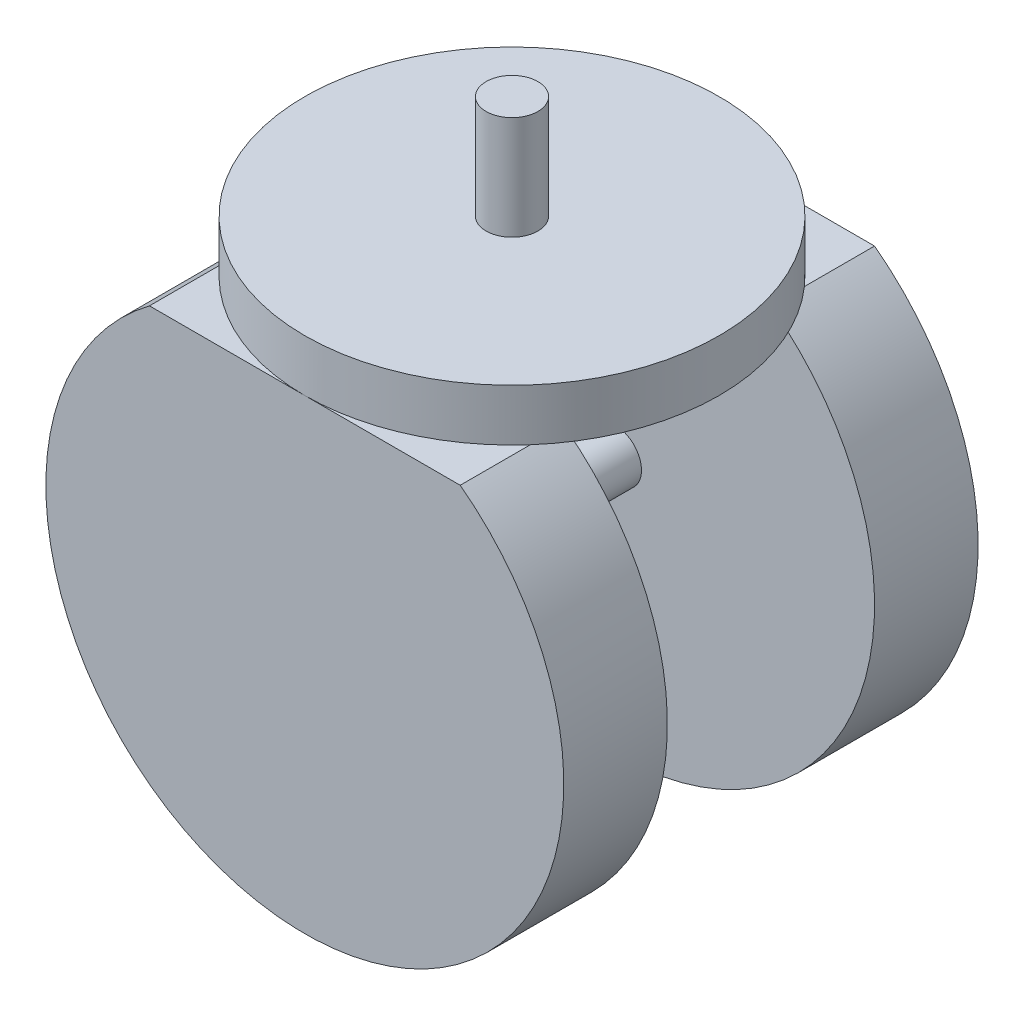
ISO-10303-21;
HEADER;
FILE_DESCRIPTION(('STEP AP214'),'2;1');
FILE_NAME('part.step','',(''),(''),'','','');
FILE_SCHEMA(('AUTOMOTIVE_DESIGN { 1 0 10303 214 1 1 1 1 }'));
ENDSEC;
DATA;
#1=APPLICATION_CONTEXT('core data for automotive mechanical design processes');
#2=APPLICATION_PROTOCOL_DEFINITION('international standard','automotive_design',2000,#1);
#3=PRODUCT_CONTEXT('',#1,'mechanical');
#4=PRODUCT('Part','Part','',(#3));
#5=PRODUCT_RELATED_PRODUCT_CATEGORY('part','',(#4));
#6=PRODUCT_DEFINITION_FORMATION('','',#4);
#7=PRODUCT_DEFINITION_CONTEXT('part definition',#1,'design');
#8=PRODUCT_DEFINITION('design','',#6,#7);
#9=PRODUCT_DEFINITION_SHAPE('','',#8);
#10=(LENGTH_UNIT() NAMED_UNIT(*) SI_UNIT(.MILLI.,.METRE.));
#11=(NAMED_UNIT(*) PLANE_ANGLE_UNIT() SI_UNIT($,.RADIAN.));
#12=(NAMED_UNIT(*) SI_UNIT($,.STERADIAN.) SOLID_ANGLE_UNIT());
#13=UNCERTAINTY_MEASURE_WITH_UNIT(LENGTH_MEASURE(1.E-05),#10,'distance_accuracy_value','');
#14=(GEOMETRIC_REPRESENTATION_CONTEXT(3) GLOBAL_UNCERTAINTY_ASSIGNED_CONTEXT((#13)) GLOBAL_UNIT_ASSIGNED_CONTEXT((#10,
#11,#12)) REPRESENTATION_CONTEXT('',''));
#15=CARTESIAN_POINT('',(0.,0.,0.));
#16=DIRECTION('',(0.,0.,1.));
#17=DIRECTION('',(1.,0.,0.));
#18=AXIS2_PLACEMENT_3D('',#15,#16,#17);
#19=CARTESIAN_POINT('',(0.,50.8,0.));
#20=DIRECTION('',(0.,-1.,0.));
#21=DIRECTION('',(0.,0.,-1.));
#22=AXIS2_PLACEMENT_3D('',#19,#20,#21);
#23=PLANE('',#22);
#24=CARTESIAN_POINT('',(0.,50.8,-25.4));
#25=DIRECTION('',(0.,1.,0.));
#26=DIRECTION('',(0.,0.,1.));
#27=AXIS2_PLACEMENT_3D('',#24,#25,#26);
#28=CIRCLE('',#27,50.8);
#29=CARTESIAN_POINT('',(0.,50.8,-76.2));
#30=VERTEX_POINT('',#29);
#31=CARTESIAN_POINT('',(-38.1,50.8,-59.0010416505203));
#32=VERTEX_POINT('',#31);
#33=EDGE_CURVE('E132',#30,#32,#28,.T.);
#34=ORIENTED_EDGE('',*,*,#33,.F.);
#35=DIRECTION('',(-1.,0.,0.));
#36=VECTOR('',#35,1.);
#37=CARTESIAN_POINT('',(-63.5,50.8,-76.2));
#38=LINE('',#37,#36);
#39=CARTESIAN_POINT('',(-38.1,50.8,-76.2));
#40=VERTEX_POINT('',#39);
#41=EDGE_CURVE('E129',#30,#40,#38,.T.);
#42=ORIENTED_EDGE('',*,*,#41,.T.);
#43=DIRECTION('',(0.,0.,1.));
#44=VECTOR('',#43,1.);
#45=CARTESIAN_POINT('',(-38.1,50.8,-76.2));
#46=LINE('',#45,#44);
#47=EDGE_CURVE('E59',#32,#40,#46,.F.);
#48=ORIENTED_EDGE('',*,*,#47,.F.);
#49=EDGE_LOOP('',(#34,#42,#48));
#50=FACE_BOUND('',#49,.T.);
#51=ADVANCED_FACE('F36',(#50),#23,.F.);
#52=CARTESIAN_POINT('',(0.,50.8,-25.4));
#53=DIRECTION('',(0.,-1.,0.));
#54=DIRECTION('',(0.,0.,-1.));
#55=AXIS2_PLACEMENT_3D('',#52,#53,#54);
#56=CIRCLE('',#55,50.8);
#57=CARTESIAN_POINT('',(-38.1,50.8,8.2010416505203));
#58=VERTEX_POINT('',#57);
#59=CARTESIAN_POINT('',(0.,50.8,25.4));
#60=VERTEX_POINT('',#59);
#61=EDGE_CURVE('E11',#58,#60,#56,.F.);
#62=ORIENTED_EDGE('',*,*,#61,.F.);
#63=DIRECTION('',(0.,0.,-1.));
#64=VECTOR('',#63,1.);
#65=CARTESIAN_POINT('',(-38.1,50.8,25.4));
#66=LINE('',#65,#64);
#67=CARTESIAN_POINT('',(-38.1,50.8,25.4));
#68=VERTEX_POINT('',#67);
#69=EDGE_CURVE('E215',#68,#58,#66,.T.);
#70=ORIENTED_EDGE('',*,*,#69,.F.);
#71=DIRECTION('',(1.,0.,0.));
#72=VECTOR('',#71,1.);
#73=CARTESIAN_POINT('',(-63.5,50.8,25.4));
#74=LINE('',#73,#72);
#75=EDGE_CURVE('E230',#68,#60,#74,.T.);
#76=ORIENTED_EDGE('',*,*,#75,.T.);
#77=EDGE_LOOP('',(#62,#70,#76));
#78=FACE_BOUND('',#77,.T.);
#79=ADVANCED_FACE('F161',(#78),#23,.F.);
#80=CARTESIAN_POINT('',(0.,0.,25.4));
#81=DIRECTION('',(0.,0.,-1.));
#82=DIRECTION('',(-1.,0.,0.));
#83=AXIS2_PLACEMENT_3D('',#80,#81,#82);
#84=CYLINDRICAL_SURFACE('',#83,63.5);
#85=CARTESIAN_POINT('',(0.,0.,25.4));
#86=DIRECTION('',(0.,0.,1.));
#87=DIRECTION('',(1.,0.,0.));
#88=AXIS2_PLACEMENT_3D('',#85,#86,#87);
#89=CIRCLE('',#88,63.5);
#90=CARTESIAN_POINT('',(38.1,50.8,25.4));
#91=VERTEX_POINT('',#90);
#92=EDGE_CURVE('E206',#68,#91,#89,.T.);
#93=ORIENTED_EDGE('',*,*,#92,.F.);
#94=ORIENTED_EDGE('',*,*,#69,.T.);
#95=CARTESIAN_POINT('',(-38.1,50.8,0.));
#96=VERTEX_POINT('',#95);
#97=EDGE_CURVE('E106',#58,#96,#66,.T.);
#98=ORIENTED_EDGE('',*,*,#97,.T.);
#99=CARTESIAN_POINT('',(0.,0.,0.));
#100=DIRECTION('',(0.,0.,1.));
#101=DIRECTION('',(1.,0.,0.));
#102=AXIS2_PLACEMENT_3D('',#99,#100,#101);
#103=CIRCLE('',#102,63.5);
#104=CARTESIAN_POINT('',(38.1,50.8,0.));
#105=VERTEX_POINT('',#104);
#106=EDGE_CURVE('E102',#96,#105,#103,.T.);
#107=ORIENTED_EDGE('',*,*,#106,.T.);
#108=DIRECTION('',(0.,0.,-1.));
#109=VECTOR('',#108,1.);
#110=CARTESIAN_POINT('',(38.1,50.8,25.4));
#111=LINE('',#110,#109);
#112=CARTESIAN_POINT('',(38.1,50.8,8.2010416505203));
#113=VERTEX_POINT('',#112);
#114=EDGE_CURVE('E96',#105,#113,#111,.F.);
#115=ORIENTED_EDGE('',*,*,#114,.T.);
#116=EDGE_CURVE('E99',#113,#91,#111,.F.);
#117=ORIENTED_EDGE('',*,*,#116,.T.);
#118=EDGE_LOOP('',(#93,#94,#98,#107,#115,#117));
#119=FACE_BOUND('',#118,.T.);
#120=ADVANCED_FACE('F38',(#119),#84,.T.);
#121=CARTESIAN_POINT('',(0.,0.,25.4));
#122=DIRECTION('',(0.,0.,1.));
#123=DIRECTION('',(1.,0.,0.));
#124=AXIS2_PLACEMENT_3D('',#121,#122,#123);
#125=PLANE('',#124);
#126=ORIENTED_EDGE('',*,*,#75,.F.);
#127=ORIENTED_EDGE('',*,*,#92,.T.);
#128=EDGE_CURVE('E113',#60,#91,#74,.T.);
#129=ORIENTED_EDGE('',*,*,#128,.F.);
#130=EDGE_LOOP('',(#126,#127,#129));
#131=FACE_BOUND('',#130,.T.);
#132=ADVANCED_FACE('F195',(#131),#125,.T.);
#133=CARTESIAN_POINT('',(0.,0.,0.));
#134=DIRECTION('',(0.,0.,1.));
#135=DIRECTION('',(1.,0.,0.));
#136=AXIS2_PLACEMENT_3D('',#133,#134,#135);
#137=PLANE('',#136);
#138=CARTESIAN_POINT('',(0.,0.,0.));
#139=DIRECTION('',(0.,0.,1.));
#140=DIRECTION('',(1.,0.,0.));
#141=AXIS2_PLACEMENT_3D('',#138,#139,#140);
#142=CIRCLE('',#141,6.35);
#143=CARTESIAN_POINT('',(6.35,0.,0.));
#144=VERTEX_POINT('',#143);
#145=EDGE_CURVE('E205',#144,#144,#142,.F.);
#146=ORIENTED_EDGE('',*,*,#145,.F.);
#147=EDGE_LOOP('',(#146));
#148=FACE_BOUND('',#147,.T.);
#149=ORIENTED_EDGE('',*,*,#106,.F.);
#150=DIRECTION('',(1.,0.,0.));
#151=VECTOR('',#150,1.);
#152=CARTESIAN_POINT('',(0.,50.8,0.));
#153=LINE('',#152,#151);
#154=EDGE_CURVE('E115',#96,#105,#153,.T.);
#155=ORIENTED_EDGE('',*,*,#154,.T.);
#156=EDGE_LOOP('',(#149,#155));
#157=FACE_BOUND('',#156,.T.);
#158=ADVANCED_FACE('F193',(#148,#157),#137,.F.);
#159=CARTESIAN_POINT('',(0.,0.,-50.8));
#160=DIRECTION('',(0.,0.,1.));
#161=DIRECTION('',(1.,0.,0.));
#162=AXIS2_PLACEMENT_3D('',#159,#160,#161);
#163=CYLINDRICAL_SURFACE('',#162,6.35);
#164=CARTESIAN_POINT('',(0.,0.,-50.8));
#165=DIRECTION('',(0.,0.,-1.));
#166=DIRECTION('',(-1.,0.,0.));
#167=AXIS2_PLACEMENT_3D('',#164,#165,#166);
#168=CIRCLE('',#167,6.35);
#169=CARTESIAN_POINT('',(-6.35,0.,-50.8));
#170=VERTEX_POINT('',#169);
#171=EDGE_CURVE('E207',#170,#170,#168,.T.);
#172=ORIENTED_EDGE('',*,*,#171,.F.);
#173=EDGE_LOOP('',(#172));
#174=FACE_BOUND('',#173,.T.);
#175=ORIENTED_EDGE('',*,*,#145,.T.);
#176=EDGE_LOOP('',(#175));
#177=FACE_BOUND('',#176,.T.);
#178=ADVANCED_FACE('F189',(#174,#177),#163,.T.);
#179=CARTESIAN_POINT('',(0.,0.,-76.2));
#180=DIRECTION('',(0.,0.,1.));
#181=DIRECTION('',(1.,0.,0.));
#182=AXIS2_PLACEMENT_3D('',#179,#180,#181);
#183=CYLINDRICAL_SURFACE('',#182,63.5);
#184=CARTESIAN_POINT('',(0.,0.,-76.2));
#185=DIRECTION('',(0.,0.,-1.));
#186=DIRECTION('',(-1.,0.,0.));
#187=AXIS2_PLACEMENT_3D('',#184,#185,#186);
#188=CIRCLE('',#187,63.5);
#189=CARTESIAN_POINT('',(38.1,50.8,-76.2));
#190=VERTEX_POINT('',#189);
#191=EDGE_CURVE('E219',#190,#40,#188,.T.);
#192=ORIENTED_EDGE('',*,*,#191,.F.);
#193=DIRECTION('',(0.,0.,1.));
#194=VECTOR('',#193,1.);
#195=CARTESIAN_POINT('',(38.1,50.8,-76.2));
#196=LINE('',#195,#194);
#197=CARTESIAN_POINT('',(38.1,50.8,-59.0010416505203));
#198=VERTEX_POINT('',#197);
#199=EDGE_CURVE('E210',#190,#198,#196,.T.);
#200=ORIENTED_EDGE('',*,*,#199,.T.);
#201=CARTESIAN_POINT('',(38.1,50.8,-50.8));
#202=VERTEX_POINT('',#201);
#203=EDGE_CURVE('E121',#198,#202,#196,.T.);
#204=ORIENTED_EDGE('',*,*,#203,.T.);
#205=CARTESIAN_POINT('',(0.,0.,-50.8));
#206=DIRECTION('',(0.,0.,-1.));
#207=DIRECTION('',(-1.,0.,0.));
#208=AXIS2_PLACEMENT_3D('',#205,#206,#207);
#209=CIRCLE('',#208,63.5);
#210=CARTESIAN_POINT('',(-38.1,50.8,-50.8));
#211=VERTEX_POINT('',#210);
#212=EDGE_CURVE('E218',#202,#211,#209,.T.);
#213=ORIENTED_EDGE('',*,*,#212,.T.);
#214=EDGE_CURVE('E229',#211,#32,#46,.F.);
#215=ORIENTED_EDGE('',*,*,#214,.T.);
#216=ORIENTED_EDGE('',*,*,#47,.T.);
#217=EDGE_LOOP('',(#192,#200,#204,#213,#215,#216));
#218=FACE_BOUND('',#217,.T.);
#219=ADVANCED_FACE('F182',(#218),#183,.T.);
#220=CARTESIAN_POINT('',(0.,0.,-76.2));
#221=DIRECTION('',(0.,0.,-1.));
#222=DIRECTION('',(-1.,0.,0.));
#223=AXIS2_PLACEMENT_3D('',#220,#221,#222);
#224=PLANE('',#223);
#225=EDGE_CURVE('E233',#190,#30,#38,.T.);
#226=ORIENTED_EDGE('',*,*,#225,.F.);
#227=ORIENTED_EDGE('',*,*,#191,.T.);
#228=ORIENTED_EDGE('',*,*,#41,.F.);
#229=EDGE_LOOP('',(#226,#227,#228));
#230=FACE_BOUND('',#229,.T.);
#231=ADVANCED_FACE('F176',(#230),#224,.T.);
#232=CARTESIAN_POINT('',(0.,0.,-50.8));
#233=DIRECTION('',(0.,0.,-1.));
#234=DIRECTION('',(-1.,0.,0.));
#235=AXIS2_PLACEMENT_3D('',#232,#233,#234);
#236=PLANE('',#235);
#237=ORIENTED_EDGE('',*,*,#171,.T.);
#238=EDGE_LOOP('',(#237));
#239=FACE_BOUND('',#238,.T.);
#240=ORIENTED_EDGE('',*,*,#212,.F.);
#241=DIRECTION('',(-1.,0.,0.));
#242=VECTOR('',#241,1.);
#243=CARTESIAN_POINT('',(0.,50.8,-50.8));
#244=LINE('',#243,#242);
#245=EDGE_CURVE('E44',#202,#211,#244,.T.);
#246=ORIENTED_EDGE('',*,*,#245,.T.);
#247=EDGE_LOOP('',(#240,#246));
#248=FACE_BOUND('',#247,.T.);
#249=ADVANCED_FACE('F172',(#239,#248),#236,.F.);
#250=EDGE_CURVE('E51',#198,#30,#28,.T.);
#251=ORIENTED_EDGE('',*,*,#250,.F.);
#252=ORIENTED_EDGE('',*,*,#199,.F.);
#253=ORIENTED_EDGE('',*,*,#225,.T.);
#254=EDGE_LOOP('',(#251,#252,#253));
#255=FACE_BOUND('',#254,.T.);
#256=ADVANCED_FACE('F166',(#255),#23,.F.);
#257=EDGE_CURVE('E111',#60,#113,#28,.T.);
#258=ORIENTED_EDGE('',*,*,#257,.F.);
#259=ORIENTED_EDGE('',*,*,#128,.T.);
#260=ORIENTED_EDGE('',*,*,#116,.F.);
#261=EDGE_LOOP('',(#258,#259,#260));
#262=FACE_BOUND('',#261,.T.);
#263=ADVANCED_FACE('F109',(#262),#23,.F.);
#264=CARTESIAN_POINT('',(0.,50.8,-25.4));
#265=DIRECTION('',(0.,1.,0.));
#266=DIRECTION('',(0.,0.,1.));
#267=AXIS2_PLACEMENT_3D('',#264,#265,#266);
#268=PLANE('',#267);
#269=EDGE_CURVE('E118',#113,#198,#28,.T.);
#270=ORIENTED_EDGE('',*,*,#269,.F.);
#271=ORIENTED_EDGE('',*,*,#114,.F.);
#272=ORIENTED_EDGE('',*,*,#154,.F.);
#273=ORIENTED_EDGE('',*,*,#97,.F.);
#274=EDGE_CURVE('E127',#32,#58,#28,.T.);
#275=ORIENTED_EDGE('',*,*,#274,.F.);
#276=ORIENTED_EDGE('',*,*,#214,.F.);
#277=ORIENTED_EDGE('',*,*,#245,.F.);
#278=ORIENTED_EDGE('',*,*,#203,.F.);
#279=EDGE_LOOP('',(#270,#271,#272,#273,#275,#276,#277,#278));
#280=FACE_BOUND('',#279,.T.);
#281=ADVANCED_FACE('F119',(#280),#268,.F.);
#282=CARTESIAN_POINT('',(0.,63.5,-25.4));
#283=DIRECTION('',(0.,-1.,0.));
#284=DIRECTION('',(0.,0.,-1.));
#285=AXIS2_PLACEMENT_3D('',#282,#283,#284);
#286=CYLINDRICAL_SURFACE('',#285,50.8);
#287=CARTESIAN_POINT('',(0.,63.5,-25.4));
#288=DIRECTION('',(0.,1.,0.));
#289=DIRECTION('',(0.,0.,1.));
#290=AXIS2_PLACEMENT_3D('',#287,#288,#289);
#291=CIRCLE('',#290,50.8);
#292=CARTESIAN_POINT('',(0.,63.5,25.4));
#293=VERTEX_POINT('',#292);
#294=EDGE_CURVE('E126',#293,#293,#291,.T.);
#295=ORIENTED_EDGE('',*,*,#294,.F.);
#296=EDGE_LOOP('',(#295));
#297=FACE_BOUND('',#296,.T.);
#298=ORIENTED_EDGE('',*,*,#257,.T.);
#299=ORIENTED_EDGE('',*,*,#269,.T.);
#300=ORIENTED_EDGE('',*,*,#250,.T.);
#301=ORIENTED_EDGE('',*,*,#33,.T.);
#302=ORIENTED_EDGE('',*,*,#274,.T.);
#303=ORIENTED_EDGE('',*,*,#61,.T.);
#304=EDGE_LOOP('',(#298,#299,#300,#301,#302,#303));
#305=FACE_BOUND('',#304,.T.);
#306=ADVANCED_FACE('F124',(#297,#305),#286,.T.);
#307=CARTESIAN_POINT('',(0.,63.5,-25.4));
#308=DIRECTION('',(0.,1.,0.));
#309=DIRECTION('',(0.,0.,1.));
#310=AXIS2_PLACEMENT_3D('',#307,#308,#309);
#311=PLANE('',#310);
#312=CARTESIAN_POINT('',(0.,63.5,-25.4));
#313=DIRECTION('',(0.,1.,0.));
#314=DIRECTION('',(0.,0.,1.));
#315=AXIS2_PLACEMENT_3D('',#312,#313,#314);
#316=CIRCLE('',#315,6.35);
#317=CARTESIAN_POINT('',(0.,63.5,-19.05));
#318=VERTEX_POINT('',#317);
#319=EDGE_CURVE('E137',#318,#318,#316,.T.);
#320=ORIENTED_EDGE('',*,*,#319,.F.);
#321=EDGE_LOOP('',(#320));
#322=FACE_BOUND('',#321,.T.);
#323=ORIENTED_EDGE('',*,*,#294,.T.);
#324=EDGE_LOOP('',(#323));
#325=FACE_BOUND('',#324,.T.);
#326=ADVANCED_FACE('F147',(#322,#325),#311,.T.);
#327=CARTESIAN_POINT('',(0.,88.9,-25.4));
#328=DIRECTION('',(0.,-1.,0.));
#329=DIRECTION('',(0.,0.,-1.));
#330=AXIS2_PLACEMENT_3D('',#327,#328,#329);
#331=CYLINDRICAL_SURFACE('',#330,6.35);
#332=CARTESIAN_POINT('',(0.,88.9,-25.4));
#333=DIRECTION('',(0.,1.,0.));
#334=DIRECTION('',(0.,0.,1.));
#335=AXIS2_PLACEMENT_3D('',#332,#333,#334);
#336=CIRCLE('',#335,6.35);
#337=CARTESIAN_POINT('',(0.,88.9,-19.05));
#338=VERTEX_POINT('',#337);
#339=EDGE_CURVE('E133',#338,#338,#336,.T.);
#340=ORIENTED_EDGE('',*,*,#339,.F.);
#341=EDGE_LOOP('',(#340));
#342=FACE_BOUND('',#341,.T.);
#343=ORIENTED_EDGE('',*,*,#319,.T.);
#344=EDGE_LOOP('',(#343));
#345=FACE_BOUND('',#344,.T.);
#346=ADVANCED_FACE('F145',(#342,#345),#331,.T.);
#347=CARTESIAN_POINT('',(0.,88.9,-25.4));
#348=DIRECTION('',(0.,1.,0.));
#349=DIRECTION('',(0.,0.,1.));
#350=AXIS2_PLACEMENT_3D('',#347,#348,#349);
#351=PLANE('',#350);
#352=ORIENTED_EDGE('',*,*,#339,.T.);
#353=EDGE_LOOP('',(#352));
#354=FACE_BOUND('',#353,.T.);
#355=ADVANCED_FACE('F293',(#354),#351,.T.);
#356=CLOSED_SHELL('',(#51,#79,#120,#132,#158,#178,#219,#231,#249,#256,#263,#281,#306,#326,#346,#355));
#357=MANIFOLD_SOLID_BREP('B2',#356);
#358=ADVANCED_BREP_SHAPE_REPRESENTATION('',(#18,#357),#14);
#359=SHAPE_DEFINITION_REPRESENTATION(#9,#358);
ENDSEC;
END-ISO-10303-21;
